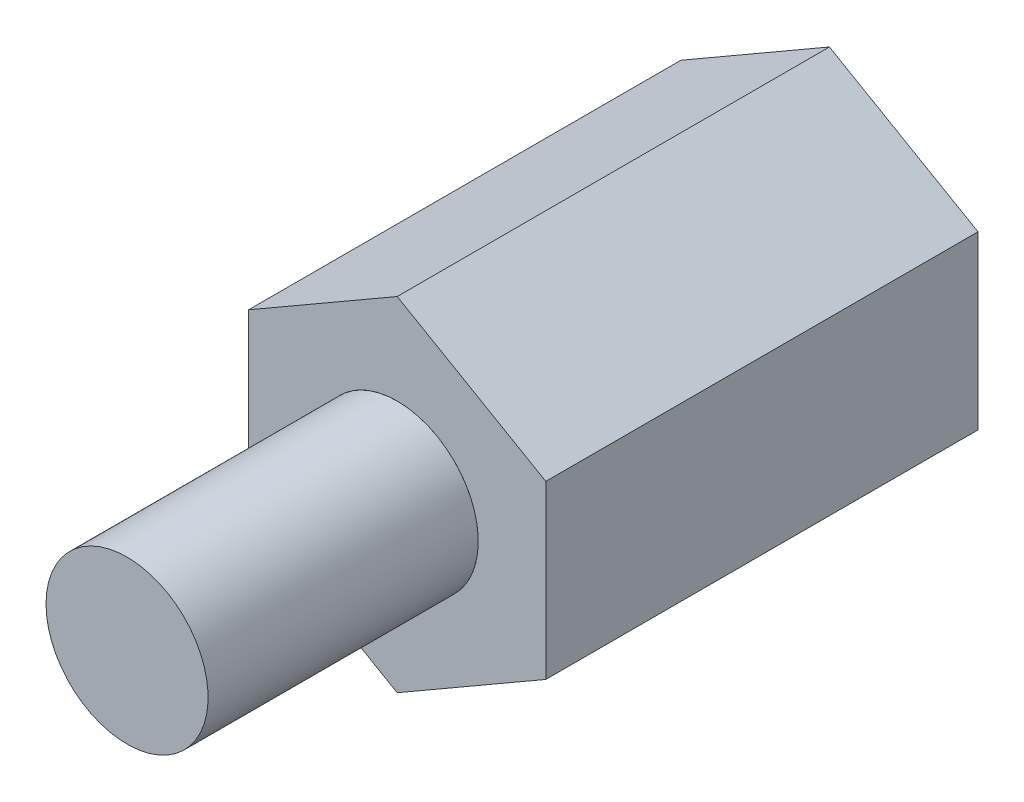
ISO-10303-21;
HEADER;
FILE_DESCRIPTION(('STEP AP214'),'2;1');
FILE_NAME('part.step','',(''),(''),'','','');
FILE_SCHEMA(('AUTOMOTIVE_DESIGN { 1 0 10303 214 1 1 1 1 }'));
ENDSEC;
DATA;
#1=APPLICATION_CONTEXT('core data for automotive mechanical design processes');
#2=APPLICATION_PROTOCOL_DEFINITION('international standard','automotive_design',2000,#1);
#3=PRODUCT_CONTEXT('',#1,'mechanical');
#4=PRODUCT('Part','Part','',(#3));
#5=PRODUCT_RELATED_PRODUCT_CATEGORY('part','',(#4));
#6=PRODUCT_DEFINITION_FORMATION('','',#4);
#7=PRODUCT_DEFINITION_CONTEXT('part definition',#1,'design');
#8=PRODUCT_DEFINITION('design','',#6,#7);
#9=PRODUCT_DEFINITION_SHAPE('','',#8);
#10=(LENGTH_UNIT() NAMED_UNIT(*) SI_UNIT(.MILLI.,.METRE.));
#11=(NAMED_UNIT(*) PLANE_ANGLE_UNIT() SI_UNIT($,.RADIAN.));
#12=(NAMED_UNIT(*) SI_UNIT($,.STERADIAN.) SOLID_ANGLE_UNIT());
#13=UNCERTAINTY_MEASURE_WITH_UNIT(LENGTH_MEASURE(1.E-05),#10,'distance_accuracy_value','');
#14=(GEOMETRIC_REPRESENTATION_CONTEXT(3) GLOBAL_UNCERTAINTY_ASSIGNED_CONTEXT((#13)) GLOBAL_UNIT_ASSIGNED_CONTEXT((#10,
#11,#12)) REPRESENTATION_CONTEXT('',''));
#15=CARTESIAN_POINT('',(0.,0.,0.));
#16=DIRECTION('',(0.,0.,1.));
#17=DIRECTION('',(1.,0.,0.));
#18=AXIS2_PLACEMENT_3D('',#15,#16,#17);
#19=CARTESIAN_POINT('',(0.,0.,13.));
#20=DIRECTION('',(0.,0.,-1.));
#21=DIRECTION('',(-1.,0.,0.));
#22=AXIS2_PLACEMENT_3D('',#19,#20,#21);
#23=CYLINDRICAL_SURFACE('',#22,1.5);
#24=CARTESIAN_POINT('',(0.,0.,13.));
#25=DIRECTION('',(0.,0.,-1.));
#26=DIRECTION('',(-1.,0.,0.));
#27=AXIS2_PLACEMENT_3D('',#24,#25,#26);
#28=CIRCLE('',#27,1.5);
#29=CARTESIAN_POINT('',(-1.5,0.,13.));
#30=VERTEX_POINT('',#29);
#31=EDGE_CURVE('E11',#30,#30,#28,.T.);
#32=ORIENTED_EDGE('',*,*,#31,.T.);
#33=EDGE_LOOP('',(#32));
#34=FACE_BOUND('',#33,.T.);
#35=CARTESIAN_POINT('',(0.,0.,8.));
#36=DIRECTION('',(0.,0.,-1.));
#37=DIRECTION('',(-1.,0.,0.));
#38=AXIS2_PLACEMENT_3D('',#35,#36,#37);
#39=CIRCLE('',#38,1.5);
#40=CARTESIAN_POINT('',(-1.5,0.,8.));
#41=VERTEX_POINT('',#40);
#42=EDGE_CURVE('E46',#41,#41,#39,.T.);
#43=ORIENTED_EDGE('',*,*,#42,.F.);
#44=EDGE_LOOP('',(#43));
#45=FACE_BOUND('',#44,.T.);
#46=ADVANCED_FACE('F43',(#34,#45),#23,.T.);
#47=CARTESIAN_POINT('',(0.,0.,13.));
#48=DIRECTION('',(0.,0.,-1.));
#49=DIRECTION('',(-1.,0.,0.));
#50=AXIS2_PLACEMENT_3D('',#47,#48,#49);
#51=PLANE('',#50);
#52=ORIENTED_EDGE('',*,*,#31,.F.);
#53=EDGE_LOOP('',(#52));
#54=FACE_BOUND('',#53,.T.);
#55=ADVANCED_FACE('F58',(#54),#51,.F.);
#56=CARTESIAN_POINT('',(0.,0.,8.));
#57=DIRECTION('',(0.,0.,-1.));
#58=DIRECTION('',(-1.,0.,0.));
#59=AXIS2_PLACEMENT_3D('',#56,#57,#58);
#60=PLANE('',#59);
#61=ORIENTED_EDGE('',*,*,#42,.T.);
#62=EDGE_LOOP('',(#61));
#63=FACE_BOUND('',#62,.T.);
#64=ADVANCED_FACE('F55',(#63),#60,.T.);
#65=CLOSED_SHELL('',(#46,#55,#64));
#66=MANIFOLD_SOLID_BREP('B2',#65);
#67=CARTESIAN_POINT('',(0.,0.,8.));
#68=DIRECTION('',(0.,0.,1.));
#69=DIRECTION('',(1.,0.,0.));
#70=AXIS2_PLACEMENT_3D('',#67,#68,#69);
#71=PLANE('',#70);
#72=DIRECTION('',(0.,1.,0.));
#73=VECTOR('',#72,1.);
#74=CARTESIAN_POINT('',(2.75,-1.58771324027147,8.));
#75=LINE('',#74,#73);
#76=CARTESIAN_POINT('',(2.75,-1.58771324027147,8.));
#77=VERTEX_POINT('',#76);
#78=CARTESIAN_POINT('',(2.75,1.58771324027147,8.));
#79=VERTEX_POINT('',#78);
#80=EDGE_CURVE('E179',#77,#79,#75,.T.);
#81=ORIENTED_EDGE('',*,*,#80,.T.);
#82=DIRECTION('',(-0.866025403784438,0.5,0.));
#83=VECTOR('',#82,1.);
#84=CARTESIAN_POINT('',(2.75,1.58771324027147,8.));
#85=LINE('',#84,#83);
#86=CARTESIAN_POINT('',(0.,3.17542648054294,8.));
#87=VERTEX_POINT('',#86);
#88=EDGE_CURVE('E137',#79,#87,#85,.T.);
#89=ORIENTED_EDGE('',*,*,#88,.T.);
#90=DIRECTION('',(-0.866025403784439,-0.5,0.));
#91=VECTOR('',#90,1.);
#92=CARTESIAN_POINT('',(0.,3.17542648054294,8.));
#93=LINE('',#92,#91);
#94=CARTESIAN_POINT('',(-2.75,1.58771324027147,8.));
#95=VERTEX_POINT('',#94);
#96=EDGE_CURVE('E150',#87,#95,#93,.T.);
#97=ORIENTED_EDGE('',*,*,#96,.T.);
#98=DIRECTION('',(0.,-1.,0.));
#99=VECTOR('',#98,1.);
#100=CARTESIAN_POINT('',(-2.75,1.58771324027147,8.));
#101=LINE('',#100,#99);
#102=CARTESIAN_POINT('',(-2.75,-1.58771324027147,8.));
#103=VERTEX_POINT('',#102);
#104=EDGE_CURVE('E144',#95,#103,#101,.T.);
#105=ORIENTED_EDGE('',*,*,#104,.T.);
#106=DIRECTION('',(0.866025403784438,-0.5,0.));
#107=VECTOR('',#106,1.);
#108=CARTESIAN_POINT('',(-2.75,-1.58771324027147,8.));
#109=LINE('',#108,#107);
#110=CARTESIAN_POINT('',(0.,-3.17542648054294,8.));
#111=VERTEX_POINT('',#110);
#112=EDGE_CURVE('E148',#103,#111,#109,.T.);
#113=ORIENTED_EDGE('',*,*,#112,.T.);
#114=DIRECTION('',(0.866025403784439,0.5,0.));
#115=VECTOR('',#114,1.);
#116=CARTESIAN_POINT('',(0.,-3.17542648054294,8.));
#117=LINE('',#116,#115);
#118=EDGE_CURVE('E100',#111,#77,#117,.T.);
#119=ORIENTED_EDGE('',*,*,#118,.T.);
#120=EDGE_LOOP('',(#81,#89,#97,#105,#113,#119));
#121=FACE_BOUND('',#120,.T.);
#122=CARTESIAN_POINT('',(0.,0.,8.));
#123=DIRECTION('',(0.,0.,1.));
#124=DIRECTION('',(1.,0.,0.));
#125=AXIS2_PLACEMENT_3D('',#122,#123,#124);
#126=CIRCLE('',#125,1.5);
#127=CARTESIAN_POINT('',(1.5,0.,8.));
#128=VERTEX_POINT('',#127);
#129=EDGE_CURVE('E172',#128,#128,#126,.T.);
#130=ORIENTED_EDGE('',*,*,#129,.F.);
#131=EDGE_LOOP('',(#130));
#132=FACE_BOUND('',#131,.T.);
#133=ADVANCED_FACE('F83',(#121,#132),#71,.T.);
#134=CARTESIAN_POINT('',(0.,0.,0.));
#135=DIRECTION('',(0.,0.,1.));
#136=DIRECTION('',(1.,0.,0.));
#137=AXIS2_PLACEMENT_3D('',#134,#135,#136);
#138=PLANE('',#137);
#139=DIRECTION('',(0.,1.,0.));
#140=VECTOR('',#139,1.);
#141=CARTESIAN_POINT('',(2.75,-1.58771324027147,0.));
#142=LINE('',#141,#140);
#143=CARTESIAN_POINT('',(2.75,-1.58771324027147,0.));
#144=VERTEX_POINT('',#143);
#145=CARTESIAN_POINT('',(2.75,1.58771324027147,0.));
#146=VERTEX_POINT('',#145);
#147=EDGE_CURVE('E168',#144,#146,#142,.T.);
#148=ORIENTED_EDGE('',*,*,#147,.F.);
#149=DIRECTION('',(0.866025403784439,0.5,0.));
#150=VECTOR('',#149,1.);
#151=CARTESIAN_POINT('',(0.,-3.17542648054294,0.));
#152=LINE('',#151,#150);
#153=CARTESIAN_POINT('',(0.,-3.17542648054294,0.));
#154=VERTEX_POINT('',#153);
#155=EDGE_CURVE('E129',#154,#144,#152,.T.);
#156=ORIENTED_EDGE('',*,*,#155,.F.);
#157=DIRECTION('',(0.866025403784438,-0.5,0.));
#158=VECTOR('',#157,1.);
#159=CARTESIAN_POINT('',(-2.75,-1.58771324027147,0.));
#160=LINE('',#159,#158);
#161=CARTESIAN_POINT('',(-2.75,-1.58771324027147,0.));
#162=VERTEX_POINT('',#161);
#163=EDGE_CURVE('E123',#162,#154,#160,.T.);
#164=ORIENTED_EDGE('',*,*,#163,.F.);
#165=DIRECTION('',(0.,-1.,0.));
#166=VECTOR('',#165,1.);
#167=CARTESIAN_POINT('',(-2.75,1.58771324027147,0.));
#168=LINE('',#167,#166);
#169=CARTESIAN_POINT('',(-2.75,1.58771324027147,0.));
#170=VERTEX_POINT('',#169);
#171=EDGE_CURVE('E158',#170,#162,#168,.T.);
#172=ORIENTED_EDGE('',*,*,#171,.F.);
#173=DIRECTION('',(-0.866025403784439,-0.5,0.));
#174=VECTOR('',#173,1.);
#175=CARTESIAN_POINT('',(0.,3.17542648054294,0.));
#176=LINE('',#175,#174);
#177=CARTESIAN_POINT('',(0.,3.17542648054294,0.));
#178=VERTEX_POINT('',#177);
#179=EDGE_CURVE('E174',#178,#170,#176,.T.);
#180=ORIENTED_EDGE('',*,*,#179,.F.);
#181=DIRECTION('',(-0.866025403784438,0.5,0.));
#182=VECTOR('',#181,1.);
#183=CARTESIAN_POINT('',(2.75,1.58771324027147,0.));
#184=LINE('',#183,#182);
#185=EDGE_CURVE('E171',#146,#178,#184,.T.);
#186=ORIENTED_EDGE('',*,*,#185,.F.);
#187=EDGE_LOOP('',(#148,#156,#164,#172,#180,#186));
#188=FACE_BOUND('',#187,.T.);
#189=CARTESIAN_POINT('',(0.,0.,0.));
#190=DIRECTION('',(0.,0.,1.));
#191=DIRECTION('',(1.,0.,0.));
#192=AXIS2_PLACEMENT_3D('',#189,#190,#191);
#193=CIRCLE('',#192,1.5);
#194=CARTESIAN_POINT('',(1.5,0.,0.));
#195=VERTEX_POINT('',#194);
#196=EDGE_CURVE('E272',#195,#195,#193,.T.);
#197=ORIENTED_EDGE('',*,*,#196,.T.);
#198=EDGE_LOOP('',(#197));
#199=FACE_BOUND('',#198,.T.);
#200=ADVANCED_FACE('F188',(#188,#199),#138,.F.);
#201=CARTESIAN_POINT('',(2.75,-1.58771324027147,8.));
#202=DIRECTION('',(-1.,0.,0.));
#203=DIRECTION('',(0.,0.,1.));
#204=AXIS2_PLACEMENT_3D('',#201,#202,#203);
#205=PLANE('',#204);
#206=ORIENTED_EDGE('',*,*,#147,.T.);
#207=DIRECTION('',(0.,0.,-1.));
#208=VECTOR('',#207,1.);
#209=CARTESIAN_POINT('',(2.75,1.58771324027147,8.));
#210=LINE('',#209,#208);
#211=EDGE_CURVE('E41',#79,#146,#210,.T.);
#212=ORIENTED_EDGE('',*,*,#211,.F.);
#213=ORIENTED_EDGE('',*,*,#80,.F.);
#214=DIRECTION('',(0.,0.,-1.));
#215=VECTOR('',#214,1.);
#216=CARTESIAN_POINT('',(2.75,-1.58771324027147,8.));
#217=LINE('',#216,#215);
#218=EDGE_CURVE('E164',#77,#144,#217,.T.);
#219=ORIENTED_EDGE('',*,*,#218,.T.);
#220=EDGE_LOOP('',(#206,#212,#213,#219));
#221=FACE_BOUND('',#220,.T.);
#222=ADVANCED_FACE('F85',(#221),#205,.F.);
#223=CARTESIAN_POINT('',(2.75,1.58771324027147,8.));
#224=DIRECTION('',(-0.5,-0.866025403784439,0.));
#225=DIRECTION('',(0.866025403784439,-0.5,0.));
#226=AXIS2_PLACEMENT_3D('',#223,#224,#225);
#227=PLANE('',#226);
#228=ORIENTED_EDGE('',*,*,#185,.T.);
#229=DIRECTION('',(0.,0.,-1.));
#230=VECTOR('',#229,1.);
#231=CARTESIAN_POINT('',(0.,3.17542648054294,8.));
#232=LINE('',#231,#230);
#233=EDGE_CURVE('E92',#87,#178,#232,.T.);
#234=ORIENTED_EDGE('',*,*,#233,.F.);
#235=ORIENTED_EDGE('',*,*,#88,.F.);
#236=ORIENTED_EDGE('',*,*,#211,.T.);
#237=EDGE_LOOP('',(#228,#234,#235,#236));
#238=FACE_BOUND('',#237,.T.);
#239=ADVANCED_FACE('F213',(#238),#227,.F.);
#240=CARTESIAN_POINT('',(0.,3.17542648054294,8.));
#241=DIRECTION('',(0.5,-0.866025403784439,0.));
#242=DIRECTION('',(0.866025403784439,0.5,0.));
#243=AXIS2_PLACEMENT_3D('',#240,#241,#242);
#244=PLANE('',#243);
#245=ORIENTED_EDGE('',*,*,#179,.T.);
#246=DIRECTION('',(0.,0.,-1.));
#247=VECTOR('',#246,1.);
#248=CARTESIAN_POINT('',(-2.75,1.58771324027147,8.));
#249=LINE('',#248,#247);
#250=EDGE_CURVE('E159',#95,#170,#249,.T.);
#251=ORIENTED_EDGE('',*,*,#250,.F.);
#252=ORIENTED_EDGE('',*,*,#96,.F.);
#253=ORIENTED_EDGE('',*,*,#233,.T.);
#254=EDGE_LOOP('',(#245,#251,#252,#253));
#255=FACE_BOUND('',#254,.T.);
#256=ADVANCED_FACE('F185',(#255),#244,.F.);
#257=CARTESIAN_POINT('',(-2.75,1.58771324027147,8.));
#258=DIRECTION('',(1.,0.,0.));
#259=DIRECTION('',(0.,0.,-1.));
#260=AXIS2_PLACEMENT_3D('',#257,#258,#259);
#261=PLANE('',#260);
#262=ORIENTED_EDGE('',*,*,#171,.T.);
#263=DIRECTION('',(0.,0.,-1.));
#264=VECTOR('',#263,1.);
#265=CARTESIAN_POINT('',(-2.75,-1.58771324027147,8.));
#266=LINE('',#265,#264);
#267=EDGE_CURVE('E155',#103,#162,#266,.T.);
#268=ORIENTED_EDGE('',*,*,#267,.F.);
#269=ORIENTED_EDGE('',*,*,#104,.F.);
#270=ORIENTED_EDGE('',*,*,#250,.T.);
#271=EDGE_LOOP('',(#262,#268,#269,#270));
#272=FACE_BOUND('',#271,.T.);
#273=ADVANCED_FACE('F156',(#272),#261,.F.);
#274=CARTESIAN_POINT('',(-2.75,-1.58771324027147,8.));
#275=DIRECTION('',(0.5,0.866025403784438,0.));
#276=DIRECTION('',(-0.866025403784439,0.5,0.));
#277=AXIS2_PLACEMENT_3D('',#274,#275,#276);
#278=PLANE('',#277);
#279=ORIENTED_EDGE('',*,*,#163,.T.);
#280=DIRECTION('',(0.,0.,-1.));
#281=VECTOR('',#280,1.);
#282=CARTESIAN_POINT('',(0.,-3.17542648054294,8.));
#283=LINE('',#282,#281);
#284=EDGE_CURVE('E160',#111,#154,#283,.T.);
#285=ORIENTED_EDGE('',*,*,#284,.F.);
#286=ORIENTED_EDGE('',*,*,#112,.F.);
#287=ORIENTED_EDGE('',*,*,#267,.T.);
#288=EDGE_LOOP('',(#279,#285,#286,#287));
#289=FACE_BOUND('',#288,.T.);
#290=ADVANCED_FACE('F162',(#289),#278,.F.);
#291=CARTESIAN_POINT('',(0.,-3.17542648054294,8.));
#292=DIRECTION('',(-0.5,0.866025403784439,0.));
#293=DIRECTION('',(-0.866025403784439,-0.5,0.));
#294=AXIS2_PLACEMENT_3D('',#291,#292,#293);
#295=PLANE('',#294);
#296=ORIENTED_EDGE('',*,*,#155,.T.);
#297=ORIENTED_EDGE('',*,*,#218,.F.);
#298=ORIENTED_EDGE('',*,*,#118,.F.);
#299=ORIENTED_EDGE('',*,*,#284,.T.);
#300=EDGE_LOOP('',(#296,#297,#298,#299));
#301=FACE_BOUND('',#300,.T.);
#302=ADVANCED_FACE('F193',(#301),#295,.F.);
#303=CARTESIAN_POINT('',(0.,0.,8.));
#304=DIRECTION('',(0.,0.,-1.));
#305=DIRECTION('',(-1.,0.,0.));
#306=AXIS2_PLACEMENT_3D('',#303,#304,#305);
#307=CYLINDRICAL_SURFACE('',#306,1.5);
#308=ORIENTED_EDGE('',*,*,#129,.T.);
#309=EDGE_LOOP('',(#308));
#310=FACE_BOUND('',#309,.T.);
#311=ORIENTED_EDGE('',*,*,#196,.F.);
#312=EDGE_LOOP('',(#311));
#313=FACE_BOUND('',#312,.T.);
#314=ADVANCED_FACE('F195',(#310,#313),#307,.F.);
#315=CLOSED_SHELL('',(#133,#200,#222,#239,#256,#273,#290,#302,#314));
#316=MANIFOLD_SOLID_BREP('B6',#315);
#317=ADVANCED_BREP_SHAPE_REPRESENTATION('',(#18,#66,#316),#14);
#318=SHAPE_DEFINITION_REPRESENTATION(#9,#317);
ENDSEC;
END-ISO-10303-21;
